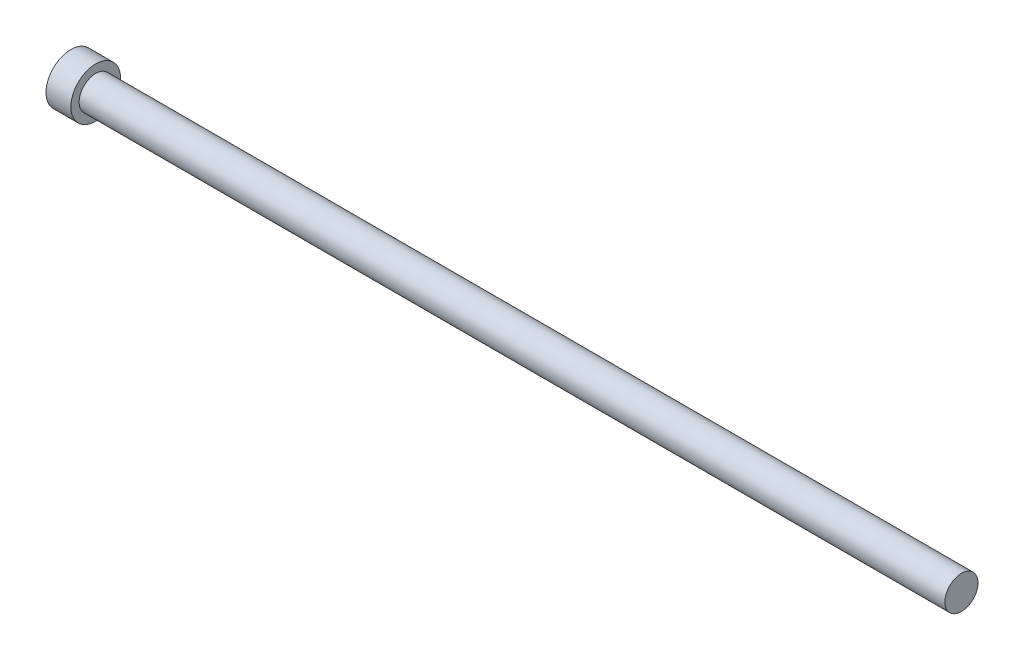
ISO-10303-21;
HEADER;
FILE_DESCRIPTION(('STEP AP214'),'2;1');
FILE_NAME('part.step','',(''),(''),'','','');
FILE_SCHEMA(('AUTOMOTIVE_DESIGN { 1 0 10303 214 1 1 1 1 }'));
ENDSEC;
DATA;
#1=APPLICATION_CONTEXT('core data for automotive mechanical design processes');
#2=APPLICATION_PROTOCOL_DEFINITION('international standard','automotive_design',2000,#1);
#3=PRODUCT_CONTEXT('',#1,'mechanical');
#4=PRODUCT('Part','Part','',(#3));
#5=PRODUCT_RELATED_PRODUCT_CATEGORY('part','',(#4));
#6=PRODUCT_DEFINITION_FORMATION('','',#4);
#7=PRODUCT_DEFINITION_CONTEXT('part definition',#1,'design');
#8=PRODUCT_DEFINITION('design','',#6,#7);
#9=PRODUCT_DEFINITION_SHAPE('','',#8);
#10=(LENGTH_UNIT() NAMED_UNIT(*) SI_UNIT(.MILLI.,.METRE.));
#11=(NAMED_UNIT(*) PLANE_ANGLE_UNIT() SI_UNIT($,.RADIAN.));
#12=(NAMED_UNIT(*) SI_UNIT($,.STERADIAN.) SOLID_ANGLE_UNIT());
#13=UNCERTAINTY_MEASURE_WITH_UNIT(LENGTH_MEASURE(1.E-05),#10,'distance_accuracy_value','');
#14=(GEOMETRIC_REPRESENTATION_CONTEXT(3) GLOBAL_UNCERTAINTY_ASSIGNED_CONTEXT((#13)) GLOBAL_UNIT_ASSIGNED_CONTEXT((#10,
#11,#12)) REPRESENTATION_CONTEXT('',''));
#15=CARTESIAN_POINT('',(0.,0.,0.));
#16=DIRECTION('',(0.,0.,1.));
#17=DIRECTION('',(1.,0.,0.));
#18=AXIS2_PLACEMENT_3D('',#15,#16,#17);
#19=CARTESIAN_POINT('',(0.,0.,0.));
#20=DIRECTION('',(1.,0.,0.));
#21=DIRECTION('',(0.,0.,-1.));
#22=AXIS2_PLACEMENT_3D('',#19,#20,#21);
#23=PLANE('',#22);
#24=CARTESIAN_POINT('',(0.,0.,0.));
#25=DIRECTION('',(-1.,0.,0.));
#26=DIRECTION('',(0.,0.,1.));
#27=AXIS2_PLACEMENT_3D('',#24,#25,#26);
#28=CIRCLE('',#27,6.);
#29=CARTESIAN_POINT('',(0.,0.,6.));
#30=VERTEX_POINT('',#29);
#31=EDGE_CURVE('E10',#30,#30,#28,.T.);
#32=ORIENTED_EDGE('',*,*,#31,.T.);
#33=EDGE_LOOP('',(#32));
#34=FACE_BOUND('',#33,.T.);
#35=ADVANCED_FACE('F30',(#34),#23,.F.);
#36=CARTESIAN_POINT('',(0.,0.,0.));
#37=DIRECTION('',(-1.,0.,0.));
#38=DIRECTION('',(0.,0.,1.));
#39=AXIS2_PLACEMENT_3D('',#36,#37,#38);
#40=CYLINDRICAL_SURFACE('',#39,6.);
#41=ORIENTED_EDGE('',*,*,#31,.F.);
#42=EDGE_LOOP('',(#41));
#43=FACE_BOUND('',#42,.T.);
#44=CARTESIAN_POINT('',(6.,0.,0.));
#45=DIRECTION('',(-1.,0.,0.));
#46=DIRECTION('',(0.,0.,1.));
#47=AXIS2_PLACEMENT_3D('',#44,#45,#46);
#48=CIRCLE('',#47,6.);
#49=CARTESIAN_POINT('',(6.,0.,6.));
#50=VERTEX_POINT('',#49);
#51=EDGE_CURVE('E36',#50,#50,#48,.T.);
#52=ORIENTED_EDGE('',*,*,#51,.T.);
#53=EDGE_LOOP('',(#52));
#54=FACE_BOUND('',#53,.T.);
#55=ADVANCED_FACE('F62',(#43,#54),#40,.T.);
#56=CARTESIAN_POINT('',(6.,6.,0.));
#57=DIRECTION('',(-1.,0.,0.));
#58=DIRECTION('',(0.,0.,1.));
#59=AXIS2_PLACEMENT_3D('',#56,#57,#58);
#60=PLANE('',#59);
#61=ORIENTED_EDGE('',*,*,#51,.F.);
#62=EDGE_LOOP('',(#61));
#63=FACE_BOUND('',#62,.T.);
#64=CARTESIAN_POINT('',(6.,0.,0.));
#65=DIRECTION('',(-1.,0.,0.));
#66=DIRECTION('',(0.,0.,1.));
#67=AXIS2_PLACEMENT_3D('',#64,#65,#66);
#68=CIRCLE('',#67,4.);
#69=CARTESIAN_POINT('',(6.,0.,4.));
#70=VERTEX_POINT('',#69);
#71=EDGE_CURVE('E40',#70,#70,#68,.T.);
#72=ORIENTED_EDGE('',*,*,#71,.T.);
#73=EDGE_LOOP('',(#72));
#74=FACE_BOUND('',#73,.T.);
#75=ADVANCED_FACE('F58',(#63,#74),#60,.F.);
#76=CARTESIAN_POINT('',(0.,0.,0.));
#77=DIRECTION('',(-1.,0.,0.));
#78=DIRECTION('',(0.,0.,1.));
#79=AXIS2_PLACEMENT_3D('',#76,#77,#78);
#80=CYLINDRICAL_SURFACE('',#79,4.);
#81=ORIENTED_EDGE('',*,*,#71,.F.);
#82=EDGE_LOOP('',(#81));
#83=FACE_BOUND('',#82,.T.);
#84=CARTESIAN_POINT('',(215.,0.,0.));
#85=DIRECTION('',(-1.,0.,0.));
#86=DIRECTION('',(0.,0.,1.));
#87=AXIS2_PLACEMENT_3D('',#84,#85,#86);
#88=CIRCLE('',#87,4.);
#89=CARTESIAN_POINT('',(215.,0.,4.));
#90=VERTEX_POINT('',#89);
#91=EDGE_CURVE('E44',#90,#90,#88,.T.);
#92=ORIENTED_EDGE('',*,*,#91,.T.);
#93=EDGE_LOOP('',(#92));
#94=FACE_BOUND('',#93,.T.);
#95=ADVANCED_FACE('F50',(#83,#94),#80,.T.);
#96=CARTESIAN_POINT('',(215.,0.,0.));
#97=DIRECTION('',(-1.,0.,0.));
#98=DIRECTION('',(0.,0.,1.));
#99=AXIS2_PLACEMENT_3D('',#96,#97,#98);
#100=PLANE('',#99);
#101=ORIENTED_EDGE('',*,*,#91,.F.);
#102=EDGE_LOOP('',(#101));
#103=FACE_BOUND('',#102,.T.);
#104=ADVANCED_FACE('F52',(#103),#100,.F.);
#105=CLOSED_SHELL('',(#35,#55,#75,#95,#104));
#106=MANIFOLD_SOLID_BREP('B2',#105);
#107=ADVANCED_BREP_SHAPE_REPRESENTATION('',(#18,#106),#14);
#108=SHAPE_DEFINITION_REPRESENTATION(#9,#107);
ENDSEC;
END-ISO-10303-21;
